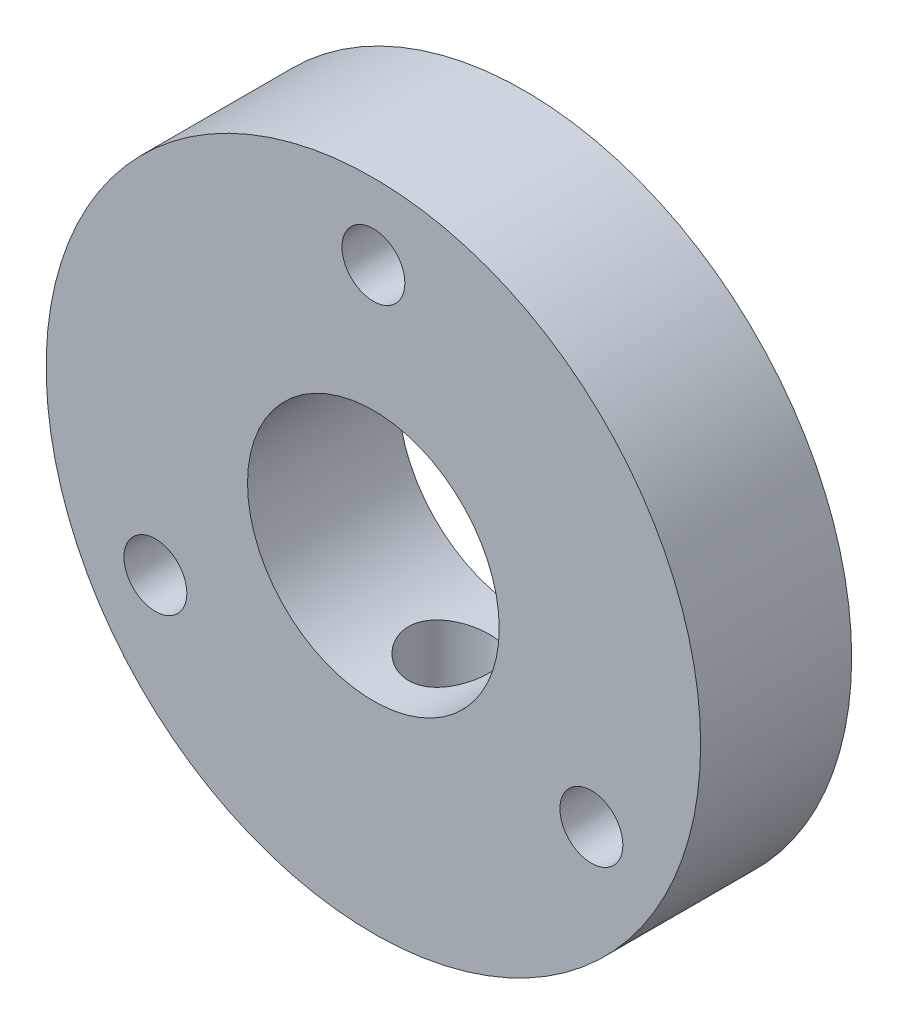
ISO-10303-21;
HEADER;
FILE_DESCRIPTION(('STEP AP214'),'2;1');
FILE_NAME('part.step','',(''),(''),'','','');
FILE_SCHEMA(('AUTOMOTIVE_DESIGN { 1 0 10303 214 1 1 1 1 }'));
ENDSEC;
DATA;
#1=APPLICATION_CONTEXT('core data for automotive mechanical design processes');
#2=APPLICATION_PROTOCOL_DEFINITION('international standard','automotive_design',2000,#1);
#3=PRODUCT_CONTEXT('',#1,'mechanical');
#4=PRODUCT('Part','Part','',(#3));
#5=PRODUCT_RELATED_PRODUCT_CATEGORY('part','',(#4));
#6=PRODUCT_DEFINITION_FORMATION('','',#4);
#7=PRODUCT_DEFINITION_CONTEXT('part definition',#1,'design');
#8=PRODUCT_DEFINITION('design','',#6,#7);
#9=PRODUCT_DEFINITION_SHAPE('','',#8);
#10=(LENGTH_UNIT() NAMED_UNIT(*) SI_UNIT(.MILLI.,.METRE.));
#11=(NAMED_UNIT(*) PLANE_ANGLE_UNIT() SI_UNIT($,.RADIAN.));
#12=(NAMED_UNIT(*) SI_UNIT($,.STERADIAN.) SOLID_ANGLE_UNIT());
#13=UNCERTAINTY_MEASURE_WITH_UNIT(LENGTH_MEASURE(1.E-05),#10,'distance_accuracy_value','');
#14=(GEOMETRIC_REPRESENTATION_CONTEXT(3) GLOBAL_UNCERTAINTY_ASSIGNED_CONTEXT((#13)) GLOBAL_UNIT_ASSIGNED_CONTEXT((#10,
#11,#12)) REPRESENTATION_CONTEXT('',''));
#15=CARTESIAN_POINT('',(0.,0.,0.));
#16=DIRECTION('',(0.,0.,1.));
#17=DIRECTION('',(1.,0.,0.));
#18=AXIS2_PLACEMENT_3D('',#15,#16,#17);
#19=CARTESIAN_POINT('',(0.,0.,-1.5));
#20=DIRECTION('',(0.,0.,1.));
#21=DIRECTION('',(1.,0.,0.));
#22=AXIS2_PLACEMENT_3D('',#19,#20,#21);
#23=CYLINDRICAL_SURFACE('',#22,6.5);
#24=CARTESIAN_POINT('',(0.,-6.5,0.799999999999999));
#25=CARTESIAN_POINT('',(-0.0447548330366206,-6.49999938348779,0.799998095240676));
#26=CARTESIAN_POINT('',(-0.0895377703022949,-6.49953288616155,0.796231723186417));
#27=CARTESIAN_POINT('',(-0.177857878539191,-6.4977168066907,0.781266160631094));
#28=CARTESIAN_POINT('',(-0.221393692626767,-6.49636629817961,0.770059172838688));
#29=CARTESIAN_POINT('',(-0.305928123824824,-6.4929343643713,0.74054722981019));
#30=CARTESIAN_POINT('',(-0.346928412835266,-6.4908534268885,0.722247010915162));
#31=CARTESIAN_POINT('',(-0.425267966121267,-6.4861921826331,0.679078344680829));
#32=CARTESIAN_POINT('',(-0.462607865281648,-6.48361196269142,0.654211039158906));
#33=CARTESIAN_POINT('',(-0.532774132531481,-6.47822489503357,0.598471970502282));
#34=CARTESIAN_POINT('',(-0.565578124186023,-6.47541702512237,0.567572135104863));
#35=CARTESIAN_POINT('',(-0.625548710356169,-6.46989938144719,0.500705386911321));
#36=CARTESIAN_POINT('',(-0.652715019895071,-6.46718961264779,0.464738218123015));
#37=CARTESIAN_POINT('',(-0.700722122164061,-6.4621648926259,0.388612778214218));
#38=CARTESIAN_POINT('',(-0.721542006036486,-6.45985125724108,0.34844122697749));
#39=CARTESIAN_POINT('',(-0.756131729855767,-6.45589418515432,0.265138702834573));
#40=CARTESIAN_POINT('',(-0.76990182916018,-6.45425072379751,0.222007838866025));
#41=CARTESIAN_POINT('',(-0.789933232705896,-6.45182980328721,0.134242960784885));
#42=CARTESIAN_POINT('',(-0.796232270740181,-6.45104799365438,0.089617681100636));
#43=CARTESIAN_POINT('',(-0.801259496306657,-6.45042556786466,-6.29256204794478E-05));
#44=CARTESIAN_POINT('',(-0.79998797931145,-6.45058491497517,-0.045118235805082));
#45=CARTESIAN_POINT('',(-0.789941173877687,-6.45182281757415,-0.134117217754709));
#46=CARTESIAN_POINT('',(-0.781207419780794,-6.45289628501613,-0.178065659015743));
#47=CARTESIAN_POINT('',(-0.75654884803459,-6.45583353878379,-0.263868341485784));
#48=CARTESIAN_POINT('',(-0.740623888757733,-6.4576973406747,-0.305722541431617));
#49=CARTESIAN_POINT('',(-0.701990213150918,-6.4620110362761,-0.386277868740256));
#50=CARTESIAN_POINT('',(-0.679263415828316,-6.46446248860784,-0.424970237740334));
#51=CARTESIAN_POINT('',(-0.627684133920293,-6.46967405403047,-0.498007607184845));
#52=CARTESIAN_POINT('',(-0.598831377664422,-6.4724341808077,-0.532352414718303));
#53=CARTESIAN_POINT('',(-0.535588865116148,-6.47797472106753,-0.595960840096814));
#54=CARTESIAN_POINT('',(-0.501163302496371,-6.4807551465572,-0.625188868329751));
#55=CARTESIAN_POINT('',(-0.42787576679451,-6.48600568290865,-0.677457057365841));
#56=CARTESIAN_POINT('',(-0.389013784007353,-6.48847579309156,-0.70049720463207));
#57=CARTESIAN_POINT('',(-0.307929346662794,-6.49282885133942,-0.739735510153925));
#58=CARTESIAN_POINT('',(-0.26570582031592,-6.49471161118579,-0.755931475754558));
#59=CARTESIAN_POINT('',(-0.179110206293276,-6.4976761102027,-0.780993604557079));
#60=CARTESIAN_POINT('',(-0.134738216212562,-6.49875788572205,-0.789860100373803));
#61=CARTESIAN_POINT('',(-0.0454129982766253,-6.4999938092836,-0.79996555812137));
#62=CARTESIAN_POINT('',(-0.000465396886322834,-6.5001539204358,-0.801253553673368));
#63=CARTESIAN_POINT('',(0.0890050182782772,-6.49954456589261,-0.796294797847351));
#64=CARTESIAN_POINT('',(0.133527840797462,-6.49877511937575,-0.790048201922163));
#65=CARTESIAN_POINT('',(0.220740443525766,-6.49639683000815,-0.770238310895306));
#66=CARTESIAN_POINT('',(0.263435605523803,-6.49479066582414,-0.756698360053512));
#67=CARTESIAN_POINT('',(0.345949209646809,-6.49091879294459,-0.722710355295567));
#68=CARTESIAN_POINT('',(0.385767556764256,-6.48865306247912,-0.702262073356545));
#69=CARTESIAN_POINT('',(0.461616450580977,-6.48369986211949,-0.654918973534179));
#70=CARTESIAN_POINT('',(0.497627036899024,-6.48101033770049,-0.627992395529172));
#71=CARTESIAN_POINT('',(0.564635210168501,-6.4755169331247,-0.568502033403201));
#72=CARTESIAN_POINT('',(0.595632604339028,-6.47271304857542,-0.53593803259637));
#73=CARTESIAN_POINT('',(0.651908148054593,-6.46728857895827,-0.465881377575298));
#74=CARTESIAN_POINT('',(0.677153821186177,-6.46466908978459,-0.428362538320275));
#75=CARTESIAN_POINT('',(0.720985024000039,-6.45992791637949,-0.349588468868636));
#76=CARTESIAN_POINT('',(0.739570683744375,-6.45780622242699,-0.308333311657533));
#77=CARTESIAN_POINT('',(0.7695015513075,-6.45430828228095,-0.223363033162181));
#78=CARTESIAN_POINT('',(0.780865154989032,-6.45293014348522,-0.179654473067627));
#79=CARTESIAN_POINT('',(0.796088619585831,-6.45106988739476,-0.0909315444427589));
#80=CARTESIAN_POINT('',(0.79994881807205,-6.45058772979074,-0.0459172347493359));
#81=CARTESIAN_POINT('',(0.80004983070291,-6.45057517617184,0.0438163336706403));
#82=CARTESIAN_POINT('',(0.796341665550651,-6.45103840699682,0.0885355426619453));
#83=CARTESIAN_POINT('',(0.781519163816346,-6.4528507434302,0.176710009891963));
#84=CARTESIAN_POINT('',(0.770404825700047,-6.45419984922212,0.220165267868836));
#85=CARTESIAN_POINT('',(0.741101272205937,-6.45762997141495,0.304572110377406));
#86=CARTESIAN_POINT('',(0.722914435200607,-6.45971074174583,0.345524531223117));
#87=CARTESIAN_POINT('',(0.679987171232155,-6.46437015731922,0.42380445085915));
#88=CARTESIAN_POINT('',(0.655246672076353,-6.46694880804611,0.461131909712062));
#89=CARTESIAN_POINT('',(0.599724854568331,-6.47233426604675,0.531363204185388));
#90=CARTESIAN_POINT('',(0.568905503762894,-6.47514244100433,0.564236870114465));
#91=CARTESIAN_POINT('',(0.502179946825409,-6.48065842024854,0.62436565282237));
#92=CARTESIAN_POINT('',(0.466272541589413,-6.48336620068481,0.651619441434335));
#93=CARTESIAN_POINT('',(0.390238629094793,-6.48838729010751,0.699820030751839));
#94=CARTESIAN_POINT('',(0.350097041821394,-6.49069910657801,0.720743186845751));
#95=CARTESIAN_POINT('',(0.266864270859668,-6.49465259272831,0.75552194712333));
#96=CARTESIAN_POINT('',(0.223776360874448,-6.49629499251945,0.769385255397089));
#97=CARTESIAN_POINT('',(0.150386427005643,-6.49832725088086,0.786320601546547));
#98=CARTESIAN_POINT('',(0.120547769905549,-6.49895148693104,0.791443034469149));
#99=CARTESIAN_POINT('',(0.0604770183582192,-6.49978806835154,0.798283365272112));
#100=CARTESIAN_POINT('',(0.0302449266937866,-6.50000041663359,0.800001287219773));
#101=CARTESIAN_POINT('',(0.,-6.5,0.799999999999999));
#102=B_SPLINE_CURVE_WITH_KNOTS('',3,(#24,#25,#26,#27,#28,#29,#30,#31,#32,#33,#34,#35,#36,#37,
#38,#39,#40,#41,#42,#43,#44,#45,#46,#47,#48,#49,#50,#51,#52,#53,#54,#55,#56,#57,#58,#59,#60,#61,
#62,#63,#64,#65,#66,#67,#68,#69,#70,#71,#72,#73,#74,#75,#76,#77,#78,#79,#80,#81,#82,#83,#84,#85,
#86,#87,#88,#89,#90,#91,#92,#93,#94,#95,#96,#97,#98,#99,#100,#101),.UNSPECIFIED.,.T.,.F.,(4,2,2,
2,2,2,2,2,2,2,2,2,2,2,2,2,2,2,2,2,2,2,2,2,2,2,2,2,2,2,2,2,2,2,2,2,2,2,4),(0.,0.134154026680088,
0.268448860601989,0.402654176304911,0.536836173115261,0.671658143673362,0.806486927628513,
0.941755231859491,1.07701855928896,1.21159576829534,1.34616772489717,1.47999550571321,
1.61382592232203,1.74801530220623,1.88221063428615,2.01730516960384,2.15240000045881,
2.28753807858797,2.42267002374997,2.55692668247915,2.69118057128773,2.82500727744347,
2.9588384012409,3.0933395093178,3.22784578836802,3.36309369171674,3.49833895369249,
3.633238326438,3.76813163005055,3.90211857970554,4.03610555711713,4.17004751568079,
4.30399094976012,4.43880062353435,4.57364212096564,4.70898119877036,4.84417226901563,
4.9348330336952,5.02549315746989),.UNSPECIFIED.);
#103=CARTESIAN_POINT('',(0.,-6.5,0.799999999999999));
#104=VERTEX_POINT('',#103);
#105=EDGE_CURVE('E10',#104,#104,#102,.T.);
#106=ORIENTED_EDGE('',*,*,#105,.F.);
#107=EDGE_LOOP('',(#106));
#108=FACE_BOUND('',#107,.T.);
#109=CARTESIAN_POINT('',(0.,0.,-1.5));
#110=DIRECTION('',(0.,0.,1.));
#111=DIRECTION('',(1.,0.,0.));
#112=AXIS2_PLACEMENT_3D('',#109,#110,#111);
#113=CIRCLE('',#112,6.5);
#114=CARTESIAN_POINT('',(6.5,0.,-1.5));
#115=VERTEX_POINT('',#114);
#116=EDGE_CURVE('E51',#115,#115,#113,.T.);
#117=ORIENTED_EDGE('',*,*,#116,.T.);
#118=EDGE_LOOP('',(#117));
#119=FACE_BOUND('',#118,.T.);
#120=CARTESIAN_POINT('',(0.,0.,1.5));
#121=DIRECTION('',(0.,0.,1.));
#122=DIRECTION('',(1.,0.,0.));
#123=AXIS2_PLACEMENT_3D('',#120,#121,#122);
#124=CIRCLE('',#123,6.5);
#125=CARTESIAN_POINT('',(6.5,0.,1.5));
#126=VERTEX_POINT('',#125);
#127=EDGE_CURVE('E56',#126,#126,#124,.T.);
#128=ORIENTED_EDGE('',*,*,#127,.F.);
#129=EDGE_LOOP('',(#128));
#130=FACE_BOUND('',#129,.T.);
#131=ADVANCED_FACE('F39',(#108,#119,#130),#23,.T.);
#132=CARTESIAN_POINT('',(0.,0.,-1.5));
#133=DIRECTION('',(0.,0.,1.));
#134=DIRECTION('',(1.,0.,0.));
#135=AXIS2_PLACEMENT_3D('',#132,#133,#134);
#136=PLANE('',#135);
#137=CARTESIAN_POINT('',(0.,5.,-1.5));
#138=DIRECTION('',(0.,0.,1.));
#139=DIRECTION('',(1.,0.,0.));
#140=AXIS2_PLACEMENT_3D('',#137,#138,#139);
#141=CIRCLE('',#140,0.624999999999999);
#142=CARTESIAN_POINT('',(0.624999999999999,5.,-1.5));
#143=VERTEX_POINT('',#142);
#144=EDGE_CURVE('E87',#143,#143,#141,.T.);
#145=ORIENTED_EDGE('',*,*,#144,.T.);
#146=EDGE_LOOP('',(#145));
#147=FACE_BOUND('',#146,.T.);
#148=CARTESIAN_POINT('',(4.33012701892218,-2.50000000000002,-1.5));
#149=DIRECTION('',(0.,0.,1.));
#150=DIRECTION('',(1.,0.,0.));
#151=AXIS2_PLACEMENT_3D('',#148,#149,#150);
#152=CIRCLE('',#151,0.625);
#153=CARTESIAN_POINT('',(4.95512701892218,-2.50000000000002,-1.5));
#154=VERTEX_POINT('',#153);
#155=EDGE_CURVE('E79',#154,#154,#152,.T.);
#156=ORIENTED_EDGE('',*,*,#155,.T.);
#157=EDGE_LOOP('',(#156));
#158=FACE_BOUND('',#157,.T.);
#159=CARTESIAN_POINT('',(-4.33012701892218,-2.50000000000002,-1.5));
#160=DIRECTION('',(0.,0.,1.));
#161=DIRECTION('',(1.,0.,0.));
#162=AXIS2_PLACEMENT_3D('',#159,#160,#161);
#163=CIRCLE('',#162,0.624999999999999);
#164=CARTESIAN_POINT('',(-3.70512701892218,-2.50000000000002,-1.5));
#165=VERTEX_POINT('',#164);
#166=EDGE_CURVE('E68',#165,#165,#163,.T.);
#167=ORIENTED_EDGE('',*,*,#166,.T.);
#168=EDGE_LOOP('',(#167));
#169=FACE_BOUND('',#168,.T.);
#170=CARTESIAN_POINT('',(0.,0.,-1.5));
#171=DIRECTION('',(0.,0.,1.));
#172=DIRECTION('',(1.,0.,0.));
#173=AXIS2_PLACEMENT_3D('',#170,#171,#172);
#174=CIRCLE('',#173,2.5);
#175=CARTESIAN_POINT('',(2.5,0.,-1.5));
#176=VERTEX_POINT('',#175);
#177=EDGE_CURVE('E62',#176,#176,#174,.T.);
#178=ORIENTED_EDGE('',*,*,#177,.T.);
#179=EDGE_LOOP('',(#178));
#180=FACE_BOUND('',#179,.T.);
#181=ORIENTED_EDGE('',*,*,#116,.F.);
#182=EDGE_LOOP('',(#181));
#183=FACE_BOUND('',#182,.T.);
#184=ADVANCED_FACE('F129',(#147,#158,#169,#180,#183),#136,.F.);
#185=CARTESIAN_POINT('',(0.,0.,1.5));
#186=DIRECTION('',(0.,0.,1.));
#187=DIRECTION('',(1.,0.,0.));
#188=AXIS2_PLACEMENT_3D('',#185,#186,#187);
#189=PLANE('',#188);
#190=CARTESIAN_POINT('',(0.,5.,1.5));
#191=DIRECTION('',(0.,0.,1.));
#192=DIRECTION('',(1.,0.,0.));
#193=AXIS2_PLACEMENT_3D('',#190,#191,#192);
#194=CIRCLE('',#193,0.624999999999988);
#195=CARTESIAN_POINT('',(0.624999999999988,5.,1.5));
#196=VERTEX_POINT('',#195);
#197=EDGE_CURVE('E91',#196,#196,#194,.T.);
#198=ORIENTED_EDGE('',*,*,#197,.F.);
#199=EDGE_LOOP('',(#198));
#200=FACE_BOUND('',#199,.T.);
#201=CARTESIAN_POINT('',(4.33012701892218,-2.50000000000002,1.5));
#202=DIRECTION('',(0.,0.,1.));
#203=DIRECTION('',(1.,0.,0.));
#204=AXIS2_PLACEMENT_3D('',#201,#202,#203);
#205=CIRCLE('',#204,0.624999999999988);
#206=CARTESIAN_POINT('',(4.95512701892217,-2.50000000000002,1.5));
#207=VERTEX_POINT('',#206);
#208=EDGE_CURVE('E83',#207,#207,#205,.T.);
#209=ORIENTED_EDGE('',*,*,#208,.F.);
#210=EDGE_LOOP('',(#209));
#211=FACE_BOUND('',#210,.T.);
#212=CARTESIAN_POINT('',(-4.33012701892218,-2.50000000000002,1.5));
#213=DIRECTION('',(0.,0.,1.));
#214=DIRECTION('',(1.,0.,0.));
#215=AXIS2_PLACEMENT_3D('',#212,#213,#214);
#216=CIRCLE('',#215,0.624999999999988);
#217=CARTESIAN_POINT('',(-3.70512701892219,-2.50000000000002,1.5));
#218=VERTEX_POINT('',#217);
#219=EDGE_CURVE('E75',#218,#218,#216,.T.);
#220=ORIENTED_EDGE('',*,*,#219,.F.);
#221=EDGE_LOOP('',(#220));
#222=FACE_BOUND('',#221,.T.);
#223=CARTESIAN_POINT('',(0.,0.,1.5));
#224=DIRECTION('',(0.,0.,1.));
#225=DIRECTION('',(1.,0.,0.));
#226=AXIS2_PLACEMENT_3D('',#223,#224,#225);
#227=CIRCLE('',#226,2.5);
#228=CARTESIAN_POINT('',(2.5,0.,1.5));
#229=VERTEX_POINT('',#228);
#230=EDGE_CURVE('E64',#229,#229,#227,.T.);
#231=ORIENTED_EDGE('',*,*,#230,.F.);
#232=EDGE_LOOP('',(#231));
#233=FACE_BOUND('',#232,.T.);
#234=ORIENTED_EDGE('',*,*,#127,.T.);
#235=EDGE_LOOP('',(#234));
#236=FACE_BOUND('',#235,.T.);
#237=ADVANCED_FACE('F124',(#200,#211,#222,#233,#236),#189,.T.);
#238=CARTESIAN_POINT('',(0.,0.,-1.5));
#239=DIRECTION('',(0.,0.,1.));
#240=DIRECTION('',(1.,0.,0.));
#241=AXIS2_PLACEMENT_3D('',#238,#239,#240);
#242=CYLINDRICAL_SURFACE('',#241,2.5);
#243=CARTESIAN_POINT('',(0.,-2.5,0.799999999999999));
#244=CARTESIAN_POINT('',(-0.0437479031579899,-2.49999989271814,0.799999878174707));
#245=CARTESIAN_POINT('',(-0.0874973185295304,-2.4988409207818,0.79639970236037));
#246=CARTESIAN_POINT('',(-0.173713450618741,-2.49433131086111,0.782134090235369));
#247=CARTESIAN_POINT('',(-0.216179931686853,-2.4909802727677,0.771467364091047));
#248=CARTESIAN_POINT('',(-0.298574612895783,-2.48245191817715,0.74346753939411));
#249=CARTESIAN_POINT('',(-0.338506736692299,-2.47727751022632,0.726145053814682));
#250=CARTESIAN_POINT('',(-0.414899381425576,-2.465634508214,0.685371584956383));
#251=CARTESIAN_POINT('',(-0.451359303512465,-2.45916569150058,0.661919547117249));
#252=CARTESIAN_POINT('',(-0.520947378897497,-2.44538533967052,0.608757943247928));
#253=CARTESIAN_POINT('',(-0.553948046123231,-2.43805478866985,0.578886450523077));
#254=CARTESIAN_POINT('',(-0.614567118466107,-2.42348532851009,0.514078466726508));
#255=CARTESIAN_POINT('',(-0.642184458968869,-2.41624643774199,0.479140976173358));
#256=CARTESIAN_POINT('',(-0.691956975369273,-2.40247405401531,0.404073572743993));
#257=CARTESIAN_POINT('',(-0.713950615550161,-2.39596392825326,0.363831859361653));
#258=CARTESIAN_POINT('',(-0.750804585672507,-2.38467328891707,0.279978828118019));
#259=CARTESIAN_POINT('',(-0.765666898864978,-2.37989229455565,0.236368451017325));
#260=CARTESIAN_POINT('',(-0.787365671556018,-2.3728006140792,0.148458696361311));
#261=CARTESIAN_POINT('',(-0.794439484234915,-2.37041707567794,0.104223949101232));
#262=CARTESIAN_POINT('',(-0.801102165297524,-2.36817415623349,0.0151362003803358));
#263=CARTESIAN_POINT('',(-0.800693135468628,-2.3683140664017,-0.0297166239376117));
#264=CARTESIAN_POINT('',(-0.792586903681035,-2.37103809524654,-0.116782792441988));
#265=CARTESIAN_POINT('',(-0.78519421066339,-2.37352008708405,-0.15902822672178));
#266=CARTESIAN_POINT('',(-0.763825294870926,-2.38048228729887,-0.241644422211603));
#267=CARTESIAN_POINT('',(-0.749848341346698,-2.38496271746849,-0.282014974792753));
#268=CARTESIAN_POINT('',(-0.715498225793996,-2.39549327079955,-0.360448929412714));
#269=CARTESIAN_POINT('',(-0.695031365518594,-2.40156614734181,-0.398468109975695));
#270=CARTESIAN_POINT('',(-0.648347471670354,-2.41458722431085,-0.470631021513425));
#271=CARTESIAN_POINT('',(-0.622128884135778,-2.42153566107407,-0.504773701371779));
#272=CARTESIAN_POINT('',(-0.563202757701928,-2.43593186070792,-0.569932336433129));
#273=CARTESIAN_POINT('',(-0.53024468124701,-2.44338760404052,-0.600720388469402));
#274=CARTESIAN_POINT('',(-0.459540716108575,-2.45766584057477,-0.656389339116826));
#275=CARTESIAN_POINT('',(-0.421794437826347,-2.46448828216864,-0.681269756571447));
#276=CARTESIAN_POINT('',(-0.342130790356186,-2.47680894872282,-0.724581721640111));
#277=CARTESIAN_POINT('',(-0.300180639720317,-2.48229540273968,-0.742956550418215));
#278=CARTESIAN_POINT('',(-0.213567925180565,-2.49124080550101,-0.772319798331353));
#279=CARTESIAN_POINT('',(-0.168906231565774,-2.49470040102319,-0.783310573908358));
#280=CARTESIAN_POINT('',(-0.0800708947946588,-2.49909712119567,-0.797200033332606));
#281=CARTESIAN_POINT('',(-0.0359501430085362,-2.50013030089079,-0.800407036805548));
#282=CARTESIAN_POINT('',(0.0522051347940522,-2.4998432765922,-0.799510390889349));
#283=CARTESIAN_POINT('',(0.0962396730437174,-2.49852343502096,-0.795407867345064));
#284=CARTESIAN_POINT('',(0.181767509101908,-2.49374190158755,-0.780254943459411));
#285=CARTESIAN_POINT('',(0.223297181239019,-2.49033743324659,-0.769390044957028));
#286=CARTESIAN_POINT('',(0.303930827300283,-2.48178792997649,-0.741249100301893));
#287=CARTESIAN_POINT('',(0.343034496897031,-2.47664267719677,-0.723972251698986));
#288=CARTESIAN_POINT('',(0.418798461935254,-2.46497765510051,-0.683014491410846));
#289=CARTESIAN_POINT('',(0.455372810250601,-2.45842663135416,-0.659183744028558));
#290=CARTESIAN_POINT('',(0.52410575150319,-2.44469704119869,-0.605973063507471));
#291=CARTESIAN_POINT('',(0.556263087776548,-2.43751829714654,-0.576591556771928));
#292=CARTESIAN_POINT('',(0.616641607443637,-2.42296483643062,-0.511662920193393));
#293=CARTESIAN_POINT('',(0.644642897379858,-2.41559442088859,-0.475909866151477));
#294=CARTESIAN_POINT('',(0.694270709961089,-2.40180221549581,-0.400052662775175));
#295=CARTESIAN_POINT('',(0.715897285121642,-2.39538041783048,-0.35994854928898));
#296=CARTESIAN_POINT('',(0.75203790151056,-2.38428131463807,-0.276578210660943));
#297=CARTESIAN_POINT('',(0.766575331558166,-2.37959828486359,-0.23332293245597));
#298=CARTESIAN_POINT('',(0.78810334125196,-2.37255640915948,-0.144796395041387));
#299=CARTESIAN_POINT('',(0.79509697503739,-2.37019662268833,-0.0995259594124583));
#300=CARTESIAN_POINT('',(0.801112676553493,-2.3681696394894,-0.010562015436566));
#301=CARTESIAN_POINT('',(0.800496942232096,-2.36838009604105,0.0331045056403981));
#302=CARTESIAN_POINT('',(0.792191775751245,-2.37117079614514,0.11967850270165));
#303=CARTESIAN_POINT('',(0.784502704305892,-2.37375091885334,0.162586017278744));
#304=CARTESIAN_POINT('',(0.762516662080648,-2.38090271554525,0.245741712695377));
#305=CARTESIAN_POINT('',(0.748328139713086,-2.38544163613636,0.286021599448296));
#306=CARTESIAN_POINT('',(0.713832137422353,-2.39598987801927,0.363660880198545));
#307=CARTESIAN_POINT('',(0.693523370573248,-2.40199950851255,0.401019657880842));
#308=CARTESIAN_POINT('',(0.646396333537033,-2.4151174718284,0.473404814907733));
#309=CARTESIAN_POINT('',(0.619346542157858,-2.42226059525979,0.508274131367164));
#310=CARTESIAN_POINT('',(0.559906998964455,-2.43668590424039,0.573095872910338));
#311=CARTESIAN_POINT('',(0.527515790834123,-2.44396812723446,0.603046952599284));
#312=CARTESIAN_POINT('',(0.456956105149166,-2.45815554099957,0.658229142961956));
#313=CARTESIAN_POINT('',(0.418625675880387,-2.46503875940166,0.683259475942162));
#314=CARTESIAN_POINT('',(0.338081764963471,-2.47736893848957,0.726490094048602));
#315=CARTESIAN_POINT('',(0.295869631604079,-2.48281639535654,0.744692739660394));
#316=CARTESIAN_POINT('',(0.211831715822422,-2.49134170532026,0.772623889915222));
#317=CARTESIAN_POINT('',(0.170188383243665,-2.49455950650724,0.782859225291554));
#318=CARTESIAN_POINT('',(0.0856970005380598,-2.49888846770699,0.796546571452004));
#319=CARTESIAN_POINT('',(0.0428492256306975,-2.50000010507806,0.800000119322733));
#320=CARTESIAN_POINT('',(0.,-2.5,0.799999999999999));
#321=B_SPLINE_CURVE_WITH_KNOTS('',3,(#243,#244,#245,#246,#247,#248,#249,#250,#251,#252,#253,
#254,#255,#256,#257,#258,#259,#260,#261,#262,#263,#264,#265,#266,#267,#268,#269,#270,#271,#272,
#273,#274,#275,#276,#277,#278,#279,#280,#281,#282,#283,#284,#285,#286,#287,#288,#289,#290,#291,
#292,#293,#294,#295,#296,#297,#298,#299,#300,#301,#302,#303,#304,#305,#306,#307,#308,#309,#310,
#311,#312,#313,#314,#315,#316,#317,#318,#319,#320),.UNSPECIFIED.,.T.,.F.,(4,2,2,2,2,2,2,2,2,2,2,
2,2,2,2,2,2,2,2,2,2,2,2,2,2,2,2,2,2,2,2,2,2,2,2,2,2,2,4),(0.,0.131086144933243,
0.262196223174182,0.393098101055855,0.524022514823514,0.658748590757834,0.793501283342128,
0.931774144133132,1.07000852835977,1.20390244997008,1.33775876391536,1.46603544670147,
1.59432636953814,1.72456097961806,1.85483081900929,1.99133642398736,2.12785314306702,
2.26553235661522,2.40316761227599,2.53525505290097,2.66732215060774,2.79591708188319,
2.92452811213591,3.05636677521965,3.18824286976834,3.32561496520954,3.46298592893395,
3.59990055330353,3.73675972635387,3.86713067475706,3.99749497509135,4.12575911428299,
4.25405024287993,4.38756878325602,4.52112378730433,4.65933142753271,4.79749124212506,
4.92591370140314,5.05430705047448),.UNSPECIFIED.);
#322=CARTESIAN_POINT('',(0.,-2.5,0.799999999999999));
#323=VERTEX_POINT('',#322);
#324=EDGE_CURVE('E95',#323,#323,#321,.T.);
#325=ORIENTED_EDGE('',*,*,#324,.T.);
#326=EDGE_LOOP('',(#325));
#327=FACE_BOUND('',#326,.T.);
#328=ORIENTED_EDGE('',*,*,#177,.F.);
#329=EDGE_LOOP('',(#328));
#330=FACE_BOUND('',#329,.T.);
#331=ORIENTED_EDGE('',*,*,#230,.T.);
#332=EDGE_LOOP('',(#331));
#333=FACE_BOUND('',#332,.T.);
#334=ADVANCED_FACE('F102',(#327,#330,#333),#242,.F.);
#335=CARTESIAN_POINT('',(-4.33012701892218,-2.50000000000002,1.5));
#336=DIRECTION('',(0.,0.,1.));
#337=DIRECTION('',(1.,0.,0.));
#338=AXIS2_PLACEMENT_3D('',#335,#336,#337);
#339=CYLINDRICAL_SURFACE('',#338,0.624999999999994);
#340=ORIENTED_EDGE('',*,*,#166,.F.);
#341=EDGE_LOOP('',(#340));
#342=FACE_BOUND('',#341,.T.);
#343=ORIENTED_EDGE('',*,*,#219,.T.);
#344=EDGE_LOOP('',(#343));
#345=FACE_BOUND('',#344,.T.);
#346=ADVANCED_FACE('F117',(#342,#345),#339,.F.);
#347=CARTESIAN_POINT('',(4.33012701892218,-2.50000000000002,1.5));
#348=DIRECTION('',(0.,0.,1.));
#349=DIRECTION('',(1.,0.,0.));
#350=AXIS2_PLACEMENT_3D('',#347,#348,#349);
#351=CYLINDRICAL_SURFACE('',#350,0.624999999999994);
#352=ORIENTED_EDGE('',*,*,#155,.F.);
#353=EDGE_LOOP('',(#352));
#354=FACE_BOUND('',#353,.T.);
#355=ORIENTED_EDGE('',*,*,#208,.T.);
#356=EDGE_LOOP('',(#355));
#357=FACE_BOUND('',#356,.T.);
#358=ADVANCED_FACE('F114',(#354,#357),#351,.F.);
#359=CARTESIAN_POINT('',(0.,5.,1.5));
#360=DIRECTION('',(0.,0.,1.));
#361=DIRECTION('',(1.,0.,0.));
#362=AXIS2_PLACEMENT_3D('',#359,#360,#361);
#363=CYLINDRICAL_SURFACE('',#362,0.624999999999994);
#364=ORIENTED_EDGE('',*,*,#144,.F.);
#365=EDGE_LOOP('',(#364));
#366=FACE_BOUND('',#365,.T.);
#367=ORIENTED_EDGE('',*,*,#197,.T.);
#368=EDGE_LOOP('',(#367));
#369=FACE_BOUND('',#368,.T.);
#370=ADVANCED_FACE('F110',(#366,#369),#363,.F.);
#371=CARTESIAN_POINT('',(0.,0.,0.));
#372=DIRECTION('',(0.,1.,0.));
#373=DIRECTION('',(0.,0.,1.));
#374=AXIS2_PLACEMENT_3D('',#371,#372,#373);
#375=CYLINDRICAL_SURFACE('',#374,0.799999999999999);
#376=ORIENTED_EDGE('',*,*,#105,.T.);
#377=EDGE_LOOP('',(#376));
#378=FACE_BOUND('',#377,.T.);
#379=ORIENTED_EDGE('',*,*,#324,.F.);
#380=EDGE_LOOP('',(#379));
#381=FACE_BOUND('',#380,.T.);
#382=ADVANCED_FACE('F106',(#378,#381),#375,.F.);
#383=CLOSED_SHELL('',(#131,#184,#237,#334,#346,#358,#370,#382));
#384=MANIFOLD_SOLID_BREP('B2',#383);
#385=ADVANCED_BREP_SHAPE_REPRESENTATION('',(#18,#384),#14);
#386=SHAPE_DEFINITION_REPRESENTATION(#9,#385);
ENDSEC;
END-ISO-10303-21;
